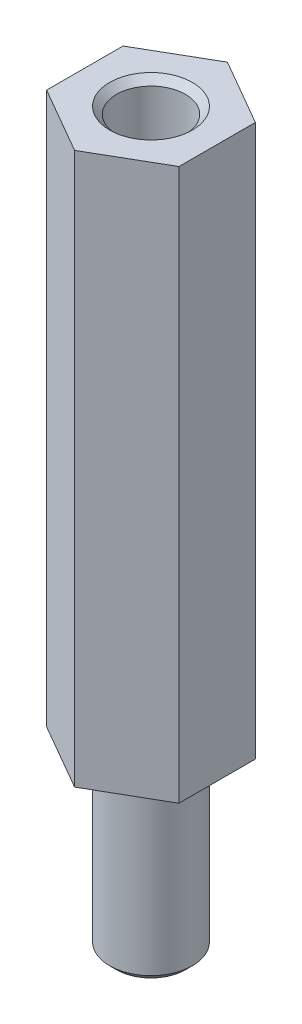
ISO-10303-21;
HEADER;
FILE_DESCRIPTION(('STEP AP214'),'2;1');
FILE_NAME('part.step','',(''),(''),'','','');
FILE_SCHEMA(('AUTOMOTIVE_DESIGN { 1 0 10303 214 1 1 1 1 }'));
ENDSEC;
DATA;
#1=APPLICATION_CONTEXT('core data for automotive mechanical design processes');
#2=APPLICATION_PROTOCOL_DEFINITION('international standard','automotive_design',2000,#1);
#3=PRODUCT_CONTEXT('',#1,'mechanical');
#4=PRODUCT('Part','Part','',(#3));
#5=PRODUCT_RELATED_PRODUCT_CATEGORY('part','',(#4));
#6=PRODUCT_DEFINITION_FORMATION('','',#4);
#7=PRODUCT_DEFINITION_CONTEXT('part definition',#1,'design');
#8=PRODUCT_DEFINITION('design','',#6,#7);
#9=PRODUCT_DEFINITION_SHAPE('','',#8);
#10=(LENGTH_UNIT() NAMED_UNIT(*) SI_UNIT(.MILLI.,.METRE.));
#11=(NAMED_UNIT(*) PLANE_ANGLE_UNIT() SI_UNIT($,.RADIAN.));
#12=(NAMED_UNIT(*) SI_UNIT($,.STERADIAN.) SOLID_ANGLE_UNIT());
#13=UNCERTAINTY_MEASURE_WITH_UNIT(LENGTH_MEASURE(1.E-05),#10,'distance_accuracy_value','');
#14=(GEOMETRIC_REPRESENTATION_CONTEXT(3) GLOBAL_UNCERTAINTY_ASSIGNED_CONTEXT((#13)) GLOBAL_UNIT_ASSIGNED_CONTEXT((#10,
#11,#12)) REPRESENTATION_CONTEXT('',''));
#15=CARTESIAN_POINT('',(0.,0.,0.));
#16=DIRECTION('',(0.,0.,1.));
#17=DIRECTION('',(1.,0.,0.));
#18=AXIS2_PLACEMENT_3D('',#15,#16,#17);
#19=CARTESIAN_POINT('',(-2.4,0.,1.3856406460551));
#20=DIRECTION('',(0.,1.,0.));
#21=DIRECTION('',(0.,0.,1.));
#22=AXIS2_PLACEMENT_3D('',#19,#20,#21);
#23=PLANE('',#22);
#24=DIRECTION('',(0.,0.,1.));
#25=VECTOR('',#24,1.);
#26=CARTESIAN_POINT('',(-2.4,0.,-1.3856406460551));
#27=LINE('',#26,#25);
#28=CARTESIAN_POINT('',(-2.4,0.,-1.3856406460551));
#29=VERTEX_POINT('',#28);
#30=CARTESIAN_POINT('',(-2.4,0.,1.3856406460551));
#31=VERTEX_POINT('',#30);
#32=EDGE_CURVE('E143',#29,#31,#27,.T.);
#33=ORIENTED_EDGE('',*,*,#32,.F.);
#34=DIRECTION('',(-0.866025403784439,0.,0.5));
#35=VECTOR('',#34,1.);
#36=CARTESIAN_POINT('',(0.,0.,-2.7712812921102));
#37=LINE('',#36,#35);
#38=CARTESIAN_POINT('',(0.,0.,-2.7712812921102));
#39=VERTEX_POINT('',#38);
#40=EDGE_CURVE('E97',#39,#29,#37,.T.);
#41=ORIENTED_EDGE('',*,*,#40,.F.);
#42=DIRECTION('',(-0.866025403784439,0.,-0.5));
#43=VECTOR('',#42,1.);
#44=CARTESIAN_POINT('',(2.4,0.,-1.3856406460551));
#45=LINE('',#44,#43);
#46=CARTESIAN_POINT('',(2.4,0.,-1.3856406460551));
#47=VERTEX_POINT('',#46);
#48=EDGE_CURVE('E91',#47,#39,#45,.T.);
#49=ORIENTED_EDGE('',*,*,#48,.F.);
#50=DIRECTION('',(0.,0.,-1.));
#51=VECTOR('',#50,1.);
#52=CARTESIAN_POINT('',(2.4,0.,1.3856406460551));
#53=LINE('',#52,#51);
#54=CARTESIAN_POINT('',(2.4,0.,1.3856406460551));
#55=VERTEX_POINT('',#54);
#56=EDGE_CURVE('E129',#55,#47,#53,.T.);
#57=ORIENTED_EDGE('',*,*,#56,.F.);
#58=DIRECTION('',(0.866025403784438,0.,-0.5));
#59=VECTOR('',#58,1.);
#60=CARTESIAN_POINT('',(0.,0.,2.7712812921102));
#61=LINE('',#60,#59);
#62=CARTESIAN_POINT('',(0.,0.,2.7712812921102));
#63=VERTEX_POINT('',#62);
#64=EDGE_CURVE('E151',#63,#55,#61,.T.);
#65=ORIENTED_EDGE('',*,*,#64,.F.);
#66=DIRECTION('',(0.866025403784439,0.,0.5));
#67=VECTOR('',#66,1.);
#68=CARTESIAN_POINT('',(-2.4,0.,1.3856406460551));
#69=LINE('',#68,#67);
#70=EDGE_CURVE('E147',#31,#63,#69,.T.);
#71=ORIENTED_EDGE('',*,*,#70,.F.);
#72=EDGE_LOOP('',(#33,#41,#49,#57,#65,#71));
#73=FACE_BOUND('',#72,.T.);
#74=CARTESIAN_POINT('',(0.,0.,0.));
#75=DIRECTION('',(0.,1.,0.));
#76=DIRECTION('',(0.,0.,1.));
#77=AXIS2_PLACEMENT_3D('',#74,#75,#76);
#78=CIRCLE('',#77,1.5);
#79=CARTESIAN_POINT('',(0.,0.,1.5));
#80=VERTEX_POINT('',#79);
#81=EDGE_CURVE('E182',#80,#80,#78,.F.);
#82=ORIENTED_EDGE('',*,*,#81,.F.);
#83=EDGE_LOOP('',(#82));
#84=FACE_BOUND('',#83,.T.);
#85=ADVANCED_FACE('F49',(#73,#84),#23,.F.);
#86=CARTESIAN_POINT('',(-2.4,20.,-1.3856406460551));
#87=DIRECTION('',(1.,0.,0.));
#88=DIRECTION('',(0.,0.,-1.));
#89=AXIS2_PLACEMENT_3D('',#86,#87,#88);
#90=PLANE('',#89);
#91=ORIENTED_EDGE('',*,*,#32,.T.);
#92=DIRECTION('',(0.,-1.,0.));
#93=VECTOR('',#92,1.);
#94=CARTESIAN_POINT('',(-2.4,20.,1.3856406460551));
#95=LINE('',#94,#93);
#96=CARTESIAN_POINT('',(-2.4,20.,1.3856406460551));
#97=VERTEX_POINT('',#96);
#98=EDGE_CURVE('E171',#97,#31,#95,.T.);
#99=ORIENTED_EDGE('',*,*,#98,.F.);
#100=DIRECTION('',(0.,0.,1.));
#101=VECTOR('',#100,1.);
#102=CARTESIAN_POINT('',(-2.4,20.,-1.3856406460551));
#103=LINE('',#102,#101);
#104=CARTESIAN_POINT('',(-2.4,20.,-1.3856406460551));
#105=VERTEX_POINT('',#104);
#106=EDGE_CURVE('E160',#105,#97,#103,.T.);
#107=ORIENTED_EDGE('',*,*,#106,.F.);
#108=DIRECTION('',(0.,-1.,0.));
#109=VECTOR('',#108,1.);
#110=CARTESIAN_POINT('',(-2.4,20.,-1.3856406460551));
#111=LINE('',#110,#109);
#112=EDGE_CURVE('E139',#105,#29,#111,.T.);
#113=ORIENTED_EDGE('',*,*,#112,.T.);
#114=EDGE_LOOP('',(#91,#99,#107,#113));
#115=FACE_BOUND('',#114,.T.);
#116=ADVANCED_FACE('F198',(#115),#90,.F.);
#117=CARTESIAN_POINT('',(-2.4,20.,1.3856406460551));
#118=DIRECTION('',(0.5,0.,-0.866025403784439));
#119=DIRECTION('',(-0.866025403784439,0.,-0.5));
#120=AXIS2_PLACEMENT_3D('',#117,#118,#119);
#121=PLANE('',#120);
#122=ORIENTED_EDGE('',*,*,#70,.T.);
#123=DIRECTION('',(0.,-1.,0.));
#124=VECTOR('',#123,1.);
#125=CARTESIAN_POINT('',(0.,20.,2.7712812921102));
#126=LINE('',#125,#124);
#127=CARTESIAN_POINT('',(0.,20.,2.7712812921102));
#128=VERTEX_POINT('',#127);
#129=EDGE_CURVE('E167',#128,#63,#126,.T.);
#130=ORIENTED_EDGE('',*,*,#129,.F.);
#131=DIRECTION('',(0.866025403784439,0.,0.5));
#132=VECTOR('',#131,1.);
#133=CARTESIAN_POINT('',(-2.4,20.,1.3856406460551));
#134=LINE('',#133,#132);
#135=EDGE_CURVE('E106',#97,#128,#134,.T.);
#136=ORIENTED_EDGE('',*,*,#135,.F.);
#137=ORIENTED_EDGE('',*,*,#98,.T.);
#138=EDGE_LOOP('',(#122,#130,#136,#137));
#139=FACE_BOUND('',#138,.T.);
#140=ADVANCED_FACE('F203',(#139),#121,.F.);
#141=CARTESIAN_POINT('',(0.,20.,2.7712812921102));
#142=DIRECTION('',(-0.5,0.,-0.866025403784438));
#143=DIRECTION('',(-0.866025403784438,0.,0.5));
#144=AXIS2_PLACEMENT_3D('',#141,#142,#143);
#145=PLANE('',#144);
#146=ORIENTED_EDGE('',*,*,#64,.T.);
#147=DIRECTION('',(0.,-1.,0.));
#148=VECTOR('',#147,1.);
#149=CARTESIAN_POINT('',(2.4,20.,1.3856406460551));
#150=LINE('',#149,#148);
#151=CARTESIAN_POINT('',(2.4,20.,1.3856406460551));
#152=VERTEX_POINT('',#151);
#153=EDGE_CURVE('E131',#152,#55,#150,.T.);
#154=ORIENTED_EDGE('',*,*,#153,.F.);
#155=DIRECTION('',(0.866025403784438,0.,-0.5));
#156=VECTOR('',#155,1.);
#157=CARTESIAN_POINT('',(0.,20.,2.7712812921102));
#158=LINE('',#157,#156);
#159=EDGE_CURVE('E120',#128,#152,#158,.T.);
#160=ORIENTED_EDGE('',*,*,#159,.F.);
#161=ORIENTED_EDGE('',*,*,#129,.T.);
#162=EDGE_LOOP('',(#146,#154,#160,#161));
#163=FACE_BOUND('',#162,.T.);
#164=ADVANCED_FACE('F218',(#163),#145,.F.);
#165=CARTESIAN_POINT('',(2.4,20.,1.3856406460551));
#166=DIRECTION('',(-1.,0.,0.));
#167=DIRECTION('',(0.,0.,1.));
#168=AXIS2_PLACEMENT_3D('',#165,#166,#167);
#169=PLANE('',#168);
#170=ORIENTED_EDGE('',*,*,#56,.T.);
#171=DIRECTION('',(0.,-1.,0.));
#172=VECTOR('',#171,1.);
#173=CARTESIAN_POINT('',(2.4,20.,-1.3856406460551));
#174=LINE('',#173,#172);
#175=CARTESIAN_POINT('',(2.4,20.,-1.3856406460551));
#176=VERTEX_POINT('',#175);
#177=EDGE_CURVE('E126',#176,#47,#174,.T.);
#178=ORIENTED_EDGE('',*,*,#177,.F.);
#179=DIRECTION('',(0.,0.,-1.));
#180=VECTOR('',#179,1.);
#181=CARTESIAN_POINT('',(2.4,20.,1.3856406460551));
#182=LINE('',#181,#180);
#183=EDGE_CURVE('E114',#152,#176,#182,.T.);
#184=ORIENTED_EDGE('',*,*,#183,.F.);
#185=ORIENTED_EDGE('',*,*,#153,.T.);
#186=EDGE_LOOP('',(#170,#178,#184,#185));
#187=FACE_BOUND('',#186,.T.);
#188=ADVANCED_FACE('F127',(#187),#169,.F.);
#189=CARTESIAN_POINT('',(2.4,20.,-1.3856406460551));
#190=DIRECTION('',(-0.5,0.,0.866025403784439));
#191=DIRECTION('',(0.866025403784439,0.,0.5));
#192=AXIS2_PLACEMENT_3D('',#189,#190,#191);
#193=PLANE('',#192);
#194=ORIENTED_EDGE('',*,*,#48,.T.);
#195=DIRECTION('',(0.,-1.,0.));
#196=VECTOR('',#195,1.);
#197=CARTESIAN_POINT('',(0.,20.,-2.7712812921102));
#198=LINE('',#197,#196);
#199=CARTESIAN_POINT('',(0.,20.,-2.7712812921102));
#200=VERTEX_POINT('',#199);
#201=EDGE_CURVE('E132',#200,#39,#198,.T.);
#202=ORIENTED_EDGE('',*,*,#201,.F.);
#203=DIRECTION('',(-0.866025403784439,0.,-0.5));
#204=VECTOR('',#203,1.);
#205=CARTESIAN_POINT('',(2.4,20.,-1.3856406460551));
#206=LINE('',#205,#204);
#207=EDGE_CURVE('E118',#176,#200,#206,.T.);
#208=ORIENTED_EDGE('',*,*,#207,.F.);
#209=ORIENTED_EDGE('',*,*,#177,.T.);
#210=EDGE_LOOP('',(#194,#202,#208,#209));
#211=FACE_BOUND('',#210,.T.);
#212=ADVANCED_FACE('F134',(#211),#193,.F.);
#213=CARTESIAN_POINT('',(0.,20.,-2.7712812921102));
#214=DIRECTION('',(0.5,0.,0.866025403784439));
#215=DIRECTION('',(0.866025403784439,0.,-0.5));
#216=AXIS2_PLACEMENT_3D('',#213,#214,#215);
#217=PLANE('',#216);
#218=ORIENTED_EDGE('',*,*,#40,.T.);
#219=ORIENTED_EDGE('',*,*,#112,.F.);
#220=DIRECTION('',(-0.866025403784439,0.,0.5));
#221=VECTOR('',#220,1.);
#222=CARTESIAN_POINT('',(0.,20.,-2.7712812921102));
#223=LINE('',#222,#221);
#224=EDGE_CURVE('E67',#200,#105,#223,.T.);
#225=ORIENTED_EDGE('',*,*,#224,.F.);
#226=ORIENTED_EDGE('',*,*,#201,.T.);
#227=EDGE_LOOP('',(#218,#219,#225,#226));
#228=FACE_BOUND('',#227,.T.);
#229=ADVANCED_FACE('F211',(#228),#217,.F.);
#230=CARTESIAN_POINT('',(-2.4,20.,1.3856406460551));
#231=DIRECTION('',(0.,1.,0.));
#232=DIRECTION('',(0.,0.,1.));
#233=AXIS2_PLACEMENT_3D('',#230,#231,#232);
#234=PLANE('',#233);
#235=CARTESIAN_POINT('',(0.,20.,0.));
#236=DIRECTION('',(0.,1.,0.));
#237=DIRECTION('',(0.,0.,1.));
#238=AXIS2_PLACEMENT_3D('',#235,#236,#237);
#239=CIRCLE('',#238,1.50000000000001);
#240=CARTESIAN_POINT('',(0.,20.,1.50000000000001));
#241=VERTEX_POINT('',#240);
#242=EDGE_CURVE('E178',#241,#241,#239,.F.);
#243=ORIENTED_EDGE('',*,*,#242,.T.);
#244=EDGE_LOOP('',(#243));
#245=FACE_BOUND('',#244,.T.);
#246=ORIENTED_EDGE('',*,*,#106,.T.);
#247=ORIENTED_EDGE('',*,*,#135,.T.);
#248=ORIENTED_EDGE('',*,*,#159,.T.);
#249=ORIENTED_EDGE('',*,*,#183,.T.);
#250=ORIENTED_EDGE('',*,*,#207,.T.);
#251=ORIENTED_EDGE('',*,*,#224,.T.);
#252=EDGE_LOOP('',(#246,#247,#248,#249,#250,#251));
#253=FACE_BOUND('',#252,.T.);
#254=ADVANCED_FACE('F116',(#245,#253),#234,.T.);
#255=CARTESIAN_POINT('',(0.,13.5,0.));
#256=DIRECTION('',(0.,1.,0.));
#257=DIRECTION('',(0.,0.,1.));
#258=AXIS2_PLACEMENT_3D('',#255,#256,#257);
#259=CYLINDRICAL_SURFACE('',#258,1.25);
#260=CARTESIAN_POINT('',(0.,19.75,0.));
#261=DIRECTION('',(0.,1.,0.));
#262=DIRECTION('',(0.,0.,1.));
#263=AXIS2_PLACEMENT_3D('',#260,#261,#262);
#264=CIRCLE('',#263,1.25);
#265=CARTESIAN_POINT('',(0.,19.75,1.25));
#266=VERTEX_POINT('',#265);
#267=EDGE_CURVE('E174',#266,#266,#264,.T.);
#268=CARTESIAN_POINT('',(0.,13.5,0.));
#269=DIRECTION('',(0.,-1.,0.));
#270=DIRECTION('',(0.,0.,-1.));
#271=AXIS2_PLACEMENT_3D('',#268,#269,#270);
#272=CIRCLE('',#271,1.25);
#273=CARTESIAN_POINT('',(0.,13.5,1.25));
#274=VERTEX_POINT('',#273);
#275=EDGE_CURVE('E148',#274,#274,#272,.T.);
#276=CARTESIAN_POINT('',(0.,19.75,1.25));
#277=CARTESIAN_POINT('',(0.,19.6848958333333,1.25));
#278=CARTESIAN_POINT('',(0.,19.6197916666667,1.25));
#279=CARTESIAN_POINT('',(0.,19.4895833333333,1.25));
#280=CARTESIAN_POINT('',(0.,19.4244791666667,1.25));
#281=CARTESIAN_POINT('',(0.,19.2942708333333,1.25));
#282=CARTESIAN_POINT('',(0.,19.2291666666667,1.25));
#283=CARTESIAN_POINT('',(0.,19.0989583333333,1.25));
#284=CARTESIAN_POINT('',(0.,19.0338541666667,1.25));
#285=CARTESIAN_POINT('',(0.,18.9036458333333,1.25));
#286=CARTESIAN_POINT('',(0.,18.8385416666667,1.25));
#287=CARTESIAN_POINT('',(0.,18.7083333333333,1.25));
#288=CARTESIAN_POINT('',(0.,18.6432291666667,1.25));
#289=CARTESIAN_POINT('',(0.,18.5130208333333,1.25));
#290=CARTESIAN_POINT('',(0.,18.4479166666667,1.25));
#291=CARTESIAN_POINT('',(0.,18.3177083333333,1.25));
#292=CARTESIAN_POINT('',(0.,18.2526041666667,1.25));
#293=CARTESIAN_POINT('',(0.,18.1223958333333,1.25));
#294=CARTESIAN_POINT('',(0.,18.0572916666667,1.25));
#295=CARTESIAN_POINT('',(0.,17.9270833333333,1.25));
#296=CARTESIAN_POINT('',(0.,17.8619791666667,1.25));
#297=CARTESIAN_POINT('',(0.,17.7317708333333,1.25));
#298=CARTESIAN_POINT('',(0.,17.6666666666667,1.25));
#299=CARTESIAN_POINT('',(0.,17.5364583333333,1.25));
#300=CARTESIAN_POINT('',(0.,17.4713541666667,1.25));
#301=CARTESIAN_POINT('',(0.,17.3411458333333,1.25));
#302=CARTESIAN_POINT('',(0.,17.2760416666667,1.25));
#303=CARTESIAN_POINT('',(0.,17.1458333333333,1.25));
#304=CARTESIAN_POINT('',(0.,17.0807291666667,1.25));
#305=CARTESIAN_POINT('',(0.,16.9505208333333,1.25));
#306=CARTESIAN_POINT('',(0.,16.8854166666667,1.25));
#307=CARTESIAN_POINT('',(0.,16.7552083333333,1.25));
#308=CARTESIAN_POINT('',(0.,16.6901041666667,1.25));
#309=CARTESIAN_POINT('',(0.,16.5598958333333,1.25));
#310=CARTESIAN_POINT('',(0.,16.4947916666667,1.25));
#311=CARTESIAN_POINT('',(0.,16.3645833333333,1.25));
#312=CARTESIAN_POINT('',(0.,16.2994791666667,1.25));
#313=CARTESIAN_POINT('',(0.,16.1692708333333,1.25));
#314=CARTESIAN_POINT('',(0.,16.1041666666667,1.25));
#315=CARTESIAN_POINT('',(0.,15.9739583333333,1.25));
#316=CARTESIAN_POINT('',(0.,15.9088541666667,1.25));
#317=CARTESIAN_POINT('',(0.,15.7786458333333,1.25));
#318=CARTESIAN_POINT('',(0.,15.7135416666667,1.25));
#319=CARTESIAN_POINT('',(0.,15.5833333333333,1.25));
#320=CARTESIAN_POINT('',(0.,15.5182291666667,1.25));
#321=CARTESIAN_POINT('',(0.,15.3880208333333,1.25));
#322=CARTESIAN_POINT('',(0.,15.3229166666667,1.25));
#323=CARTESIAN_POINT('',(0.,15.1927083333333,1.25));
#324=CARTESIAN_POINT('',(0.,15.1276041666667,1.25));
#325=CARTESIAN_POINT('',(0.,14.9973958333333,1.25));
#326=CARTESIAN_POINT('',(0.,14.9322916666667,1.25));
#327=CARTESIAN_POINT('',(0.,14.8020833333333,1.25));
#328=CARTESIAN_POINT('',(0.,14.7369791666667,1.25));
#329=CARTESIAN_POINT('',(0.,14.6067708333333,1.25));
#330=CARTESIAN_POINT('',(0.,14.5416666666667,1.25));
#331=CARTESIAN_POINT('',(0.,14.4114583333333,1.25));
#332=CARTESIAN_POINT('',(0.,14.3463541666667,1.25));
#333=CARTESIAN_POINT('',(0.,14.2161458333333,1.25));
#334=CARTESIAN_POINT('',(0.,14.1510416666667,1.25));
#335=CARTESIAN_POINT('',(0.,14.0208333333333,1.25));
#336=CARTESIAN_POINT('',(0.,13.9557291666667,1.25));
#337=CARTESIAN_POINT('',(0.,13.8255208333333,1.25));
#338=CARTESIAN_POINT('',(0.,13.7604166666667,1.25));
#339=CARTESIAN_POINT('',(0.,13.6302083333333,1.25));
#340=CARTESIAN_POINT('',(0.,13.5651041666667,1.25));
#341=CARTESIAN_POINT('',(0.,13.5,1.25));
#342=B_SPLINE_CURVE_WITH_KNOTS('',3,(#276,#277,#278,#279,#280,#281,#282,#283,#284,#285,#286,
#287,#288,#289,#290,#291,#292,#293,#294,#295,#296,#297,#298,#299,#300,#301,#302,#303,#304,#305,
#306,#307,#308,#309,#310,#311,#312,#313,#314,#315,#316,#317,#318,#319,#320,#321,#322,#323,#324,
#325,#326,#327,#328,#329,#330,#331,#332,#333,#334,#335,#336,#337,#338,#339,#340,#341),
.UNSPECIFIED.,.F.,.F.,(4,2,2,2,2,2,2,2,2,2,2,2,2,2,2,2,2,2,2,2,2,2,2,2,2,2,2,2,2,2,2,2,4),(0.,
0.195312499999999,0.390624999999999,0.585937499999998,0.781250000000001,0.976562499999997,
1.171875,1.3671875,1.5625,1.7578125,1.953125,2.1484375,2.34375,2.53906249999999,
2.73437499999999,2.92968749999999,3.12499999999999,3.32031249999999,3.51562499999999,
3.71093749999999,3.90624999999999,4.10156249999999,4.29687499999999,4.49218749999999,
4.68749999999999,4.88281249999999,5.07812499999999,5.27343749999999,5.46874999999999,
5.66406249999998,5.85937499999999,6.05468749999999,6.24999999999998),.UNSPECIFIED.);
#343=EDGE_CURVE('BSEAM226',#266,#274,#342,.T.);
#344=ORIENTED_EDGE('',*,*,#267,.T.);
#345=ORIENTED_EDGE('',*,*,#275,.T.);
#346=ORIENTED_EDGE('',*,*,#343,.T.);
#347=ORIENTED_EDGE('',*,*,#343,.F.);
#348=EDGE_LOOP('',(#344,#346,#345,#347));
#349=FACE_BOUND('',#348,.T.);
#350=ADVANCED_FACE('F226',(#349),#259,.F.);
#351=CARTESIAN_POINT('',(0.,19.75,0.));
#352=DIRECTION('',(0.,1.,0.));
#353=DIRECTION('',(0.,0.,1.));
#354=AXIS2_PLACEMENT_3D('',#351,#352,#353);
#355=CONICAL_SURFACE('',#354,1.25,0.785398163397443);
#356=ORIENTED_EDGE('',*,*,#242,.F.);
#357=EDGE_LOOP('',(#356));
#358=FACE_BOUND('',#357,.T.);
#359=ORIENTED_EDGE('',*,*,#267,.F.);
#360=EDGE_LOOP('',(#359));
#361=FACE_BOUND('',#360,.T.);
#362=ADVANCED_FACE('F223',(#358,#361),#355,.F.);
#363=CARTESIAN_POINT('',(0.,13.5,0.));
#364=DIRECTION('',(0.,1.,0.));
#365=DIRECTION('',(0.,0.,1.));
#366=AXIS2_PLACEMENT_3D('',#363,#364,#365);
#367=CONICAL_SURFACE('',#366,1.25,1.02974425867665);
#368=CARTESIAN_POINT('',(0.,12.7489242262155,0.));
#369=VERTEX_POINT('',#368);
#370=VERTEX_LOOP('',#369);
#371=FACE_BOUND('',#370,.T.);
#372=ORIENTED_EDGE('',*,*,#275,.F.);
#373=EDGE_LOOP('',(#372));
#374=FACE_BOUND('',#373,.T.);
#375=ADVANCED_FACE('F225',(#371,#374),#367,.F.);
#376=CARTESIAN_POINT('',(0.,-6.5,0.));
#377=DIRECTION('',(0.,1.,0.));
#378=DIRECTION('',(0.,0.,1.));
#379=AXIS2_PLACEMENT_3D('',#376,#377,#378);
#380=CYLINDRICAL_SURFACE('',#379,1.5);
#381=CARTESIAN_POINT('',(0.,-6.25000000000001,0.));
#382=DIRECTION('',(0.,-1.,0.));
#383=DIRECTION('',(0.,0.,-1.));
#384=AXIS2_PLACEMENT_3D('',#381,#382,#383);
#385=CIRCLE('',#384,1.5);
#386=CARTESIAN_POINT('',(0.,-6.25000000000001,1.5));
#387=VERTEX_POINT('',#386);
#388=EDGE_CURVE('E11',#387,#387,#385,.F.);
#389=CARTESIAN_POINT('',(0.,-6.25000000000001,1.5));
#390=CARTESIAN_POINT('',(0.,-6.18489583333335,1.5));
#391=CARTESIAN_POINT('',(0.,-6.11979166666668,1.5));
#392=CARTESIAN_POINT('',(0.,-5.98958333333334,1.5));
#393=CARTESIAN_POINT('',(0.,-5.92447916666668,1.5));
#394=CARTESIAN_POINT('',(0.,-5.79427083333334,1.5));
#395=CARTESIAN_POINT('',(0.,-5.72916666666668,1.5));
#396=CARTESIAN_POINT('',(0.,-5.59895833333334,1.5));
#397=CARTESIAN_POINT('',(0.,-5.53385416666668,1.5));
#398=CARTESIAN_POINT('',(0.,-5.40364583333334,1.5));
#399=CARTESIAN_POINT('',(0.,-5.33854166666668,1.5));
#400=CARTESIAN_POINT('',(0.,-5.20833333333334,1.5));
#401=CARTESIAN_POINT('',(0.,-5.14322916666668,1.5));
#402=CARTESIAN_POINT('',(0.,-5.01302083333334,1.5));
#403=CARTESIAN_POINT('',(0.,-4.94791666666668,1.5));
#404=CARTESIAN_POINT('',(0.,-4.81770833333334,1.5));
#405=CARTESIAN_POINT('',(0.,-4.75260416666668,1.5));
#406=CARTESIAN_POINT('',(0.,-4.62239583333334,1.5));
#407=CARTESIAN_POINT('',(0.,-4.55729166666668,1.5));
#408=CARTESIAN_POINT('',(0.,-4.42708333333334,1.5));
#409=CARTESIAN_POINT('',(0.,-4.36197916666668,1.5));
#410=CARTESIAN_POINT('',(0.,-4.23177083333334,1.5));
#411=CARTESIAN_POINT('',(0.,-4.16666666666667,1.5));
#412=CARTESIAN_POINT('',(0.,-4.03645833333334,1.5));
#413=CARTESIAN_POINT('',(0.,-3.97135416666667,1.5));
#414=CARTESIAN_POINT('',(0.,-3.84114583333334,1.5));
#415=CARTESIAN_POINT('',(0.,-3.77604166666667,1.5));
#416=CARTESIAN_POINT('',(0.,-3.64583333333334,1.5));
#417=CARTESIAN_POINT('',(0.,-3.58072916666667,1.5));
#418=CARTESIAN_POINT('',(0.,-3.45052083333334,1.5));
#419=CARTESIAN_POINT('',(0.,-3.38541666666667,1.5));
#420=CARTESIAN_POINT('',(0.,-3.25520833333334,1.5));
#421=CARTESIAN_POINT('',(0.,-3.19010416666667,1.5));
#422=CARTESIAN_POINT('',(0.,-3.05989583333334,1.5));
#423=CARTESIAN_POINT('',(0.,-2.99479166666667,1.5));
#424=CARTESIAN_POINT('',(0.,-2.86458333333334,1.5));
#425=CARTESIAN_POINT('',(0.,-2.79947916666667,1.5));
#426=CARTESIAN_POINT('',(0.,-2.66927083333334,1.5));
#427=CARTESIAN_POINT('',(0.,-2.60416666666667,1.5));
#428=CARTESIAN_POINT('',(0.,-2.47395833333334,1.5));
#429=CARTESIAN_POINT('',(0.,-2.40885416666667,1.5));
#430=CARTESIAN_POINT('',(0.,-2.27864583333334,1.5));
#431=CARTESIAN_POINT('',(0.,-2.21354166666667,1.5));
#432=CARTESIAN_POINT('',(0.,-2.08333333333334,1.5));
#433=CARTESIAN_POINT('',(0.,-2.01822916666667,1.5));
#434=CARTESIAN_POINT('',(0.,-1.88802083333334,1.5));
#435=CARTESIAN_POINT('',(0.,-1.82291666666667,1.5));
#436=CARTESIAN_POINT('',(0.,-1.69270833333334,1.5));
#437=CARTESIAN_POINT('',(0.,-1.62760416666667,1.5));
#438=CARTESIAN_POINT('',(0.,-1.49739583333334,1.5));
#439=CARTESIAN_POINT('',(0.,-1.43229166666667,1.5));
#440=CARTESIAN_POINT('',(0.,-1.30208333333334,1.5));
#441=CARTESIAN_POINT('',(0.,-1.23697916666667,1.5));
#442=CARTESIAN_POINT('',(0.,-1.10677083333334,1.5));
#443=CARTESIAN_POINT('',(0.,-1.04166666666667,1.5));
#444=CARTESIAN_POINT('',(0.,-0.911458333333335,1.5));
#445=CARTESIAN_POINT('',(0.,-0.846354166666668,1.5));
#446=CARTESIAN_POINT('',(0.,-0.716145833333335,1.5));
#447=CARTESIAN_POINT('',(0.,-0.651041666666668,1.5));
#448=CARTESIAN_POINT('',(0.,-0.520833333333334,1.5));
#449=CARTESIAN_POINT('',(0.,-0.455729166666667,1.5));
#450=CARTESIAN_POINT('',(0.,-0.325520833333334,1.5));
#451=CARTESIAN_POINT('',(0.,-0.260416666666667,1.5));
#452=CARTESIAN_POINT('',(0.,-0.130208333333333,1.5));
#453=CARTESIAN_POINT('',(0.,-0.0651041666666667,1.5));
#454=CARTESIAN_POINT('',(0.,0.,1.5));
#455=B_SPLINE_CURVE_WITH_KNOTS('',3,(#389,#390,#391,#392,#393,#394,#395,#396,#397,#398,#399,
#400,#401,#402,#403,#404,#405,#406,#407,#408,#409,#410,#411,#412,#413,#414,#415,#416,#417,#418,
#419,#420,#421,#422,#423,#424,#425,#426,#427,#428,#429,#430,#431,#432,#433,#434,#435,#436,#437,
#438,#439,#440,#441,#442,#443,#444,#445,#446,#447,#448,#449,#450,#451,#452,#453,#454),
.UNSPECIFIED.,.F.,.F.,(4,2,2,2,2,2,2,2,2,2,2,2,2,2,2,2,2,2,2,2,2,2,2,2,2,2,2,2,2,2,2,2,4),(0.,
0.1953125,0.390625,0.585937500000001,0.781250000000001,0.976562500000002,1.171875,1.3671875,
1.5625,1.7578125,1.953125,2.1484375,2.34375,2.5390625,2.734375,2.92968750000001,
3.12500000000001,3.32031250000001,3.51562500000001,3.71093750000001,3.90625000000001,
4.10156250000001,4.29687500000001,4.49218750000001,4.68750000000001,4.88281250000001,
5.07812500000001,5.27343750000001,5.46875000000001,5.66406250000001,5.85937500000001,
6.05468750000001,6.25000000000001),.UNSPECIFIED.);
#456=EDGE_CURVE('BSEAM194',#387,#80,#455,.T.);
#457=ORIENTED_EDGE('',*,*,#388,.T.);
#458=ORIENTED_EDGE('',*,*,#81,.T.);
#459=ORIENTED_EDGE('',*,*,#456,.T.);
#460=ORIENTED_EDGE('',*,*,#456,.F.);
#461=EDGE_LOOP('',(#457,#459,#458,#460));
#462=FACE_BOUND('',#461,.T.);
#463=ADVANCED_FACE('F194',(#462),#380,.T.);
#464=CARTESIAN_POINT('',(0.,-6.5,0.));
#465=DIRECTION('',(0.,-1.,0.));
#466=DIRECTION('',(0.,0.,-1.));
#467=AXIS2_PLACEMENT_3D('',#464,#465,#466);
#468=PLANE('',#467);
#469=CARTESIAN_POINT('',(0.,-6.5,0.));
#470=DIRECTION('',(0.,-1.,0.));
#471=DIRECTION('',(0.,0.,-1.));
#472=AXIS2_PLACEMENT_3D('',#469,#470,#471);
#473=CIRCLE('',#472,1.25000000000001);
#474=CARTESIAN_POINT('',(0.,-6.5,-1.25000000000001));
#475=VERTEX_POINT('',#474);
#476=EDGE_CURVE('E59',#475,#475,#473,.T.);
#477=ORIENTED_EDGE('',*,*,#476,.T.);
#478=EDGE_LOOP('',(#477));
#479=FACE_BOUND('',#478,.T.);
#480=ADVANCED_FACE('F188',(#479),#468,.T.);
#481=CARTESIAN_POINT('',(0.,-6.5,0.));
#482=DIRECTION('',(0.,1.,0.));
#483=DIRECTION('',(0.,0.,1.));
#484=AXIS2_PLACEMENT_3D('',#481,#482,#483);
#485=CONICAL_SURFACE('',#484,1.25000000000001,0.785398163397445);
#486=ORIENTED_EDGE('',*,*,#388,.F.);
#487=EDGE_LOOP('',(#486));
#488=FACE_BOUND('',#487,.T.);
#489=ORIENTED_EDGE('',*,*,#476,.F.);
#490=EDGE_LOOP('',(#489));
#491=FACE_BOUND('',#490,.T.);
#492=ADVANCED_FACE('F51',(#488,#491),#485,.T.);
#493=CLOSED_SHELL('',(#85,#116,#140,#164,#188,#212,#229,#254,#350,#362,#375,#463,#480,#492));
#494=MANIFOLD_SOLID_BREP('B2',#493);
#495=ADVANCED_BREP_SHAPE_REPRESENTATION('',(#18,#494),#14);
#496=SHAPE_DEFINITION_REPRESENTATION(#9,#495);
ENDSEC;
END-ISO-10303-21;
